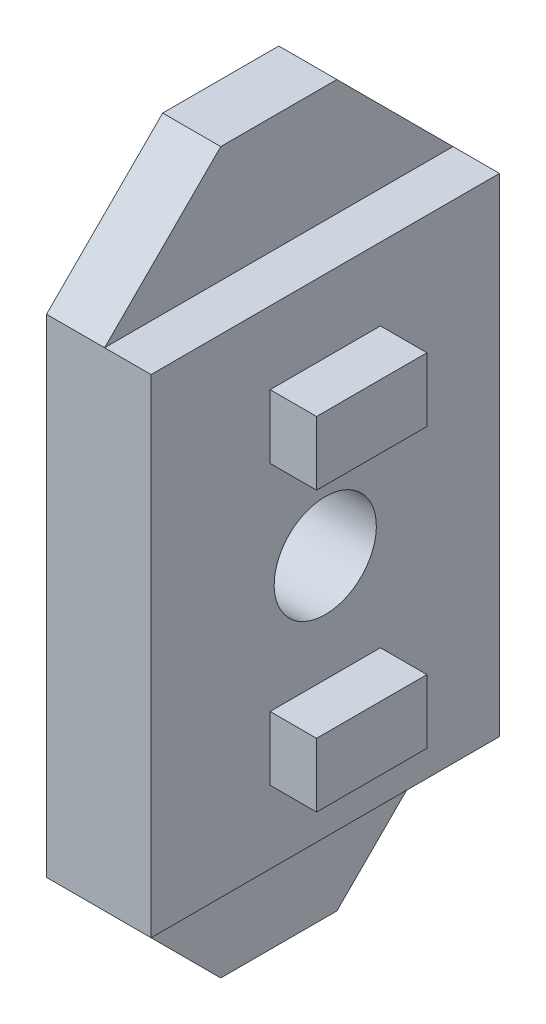
ISO-10303-21;
HEADER;
FILE_DESCRIPTION(('STEP AP214'),'2;1');
FILE_NAME('part.step','',(''),(''),'','','');
FILE_SCHEMA(('AUTOMOTIVE_DESIGN { 1 0 10303 214 1 1 1 1 }'));
ENDSEC;
DATA;
#1=APPLICATION_CONTEXT('core data for automotive mechanical design processes');
#2=APPLICATION_PROTOCOL_DEFINITION('international standard','automotive_design',2000,#1);
#3=PRODUCT_CONTEXT('',#1,'mechanical');
#4=PRODUCT('Part','Part','',(#3));
#5=PRODUCT_RELATED_PRODUCT_CATEGORY('part','',(#4));
#6=PRODUCT_DEFINITION_FORMATION('','',#4);
#7=PRODUCT_DEFINITION_CONTEXT('part definition',#1,'design');
#8=PRODUCT_DEFINITION('design','',#6,#7);
#9=PRODUCT_DEFINITION_SHAPE('','',#8);
#10=(LENGTH_UNIT() NAMED_UNIT(*) SI_UNIT(.MILLI.,.METRE.));
#11=(NAMED_UNIT(*) PLANE_ANGLE_UNIT() SI_UNIT($,.RADIAN.));
#12=(NAMED_UNIT(*) SI_UNIT($,.STERADIAN.) SOLID_ANGLE_UNIT());
#13=UNCERTAINTY_MEASURE_WITH_UNIT(LENGTH_MEASURE(1.E-05),#10,'distance_accuracy_value','');
#14=(GEOMETRIC_REPRESENTATION_CONTEXT(3) GLOBAL_UNCERTAINTY_ASSIGNED_CONTEXT((#13)) GLOBAL_UNIT_ASSIGNED_CONTEXT((#10,
#11,#12)) REPRESENTATION_CONTEXT('',''));
#15=CARTESIAN_POINT('',(0.,0.,0.));
#16=DIRECTION('',(0.,0.,1.));
#17=DIRECTION('',(1.,0.,0.));
#18=AXIS2_PLACEMENT_3D('',#15,#16,#17);
#19=CARTESIAN_POINT('',(68.1666442121514,393.453945818601,315.85001331669));
#20=DIRECTION('',(-1.,0.,0.));
#21=DIRECTION('',(0.,1.,0.));
#22=AXIS2_PLACEMENT_3D('',#19,#20,#21);
#23=CYLINDRICAL_SURFACE('',#22,2.2);
#24=CARTESIAN_POINT('',(74.6666442121514,393.453945818601,315.85001331669));
#25=DIRECTION('',(1.,0.,0.));
#26=DIRECTION('',(0.,1.,0.));
#27=AXIS2_PLACEMENT_3D('',#24,#25,#26);
#28=CIRCLE('',#27,2.2);
#29=CARTESIAN_POINT('',(74.6666442121514,395.653945818601,315.85001331669));
#30=VERTEX_POINT('',#29);
#31=EDGE_CURVE('E448',#30,#30,#28,.T.);
#32=ORIENTED_EDGE('',*,*,#31,.F.);
#33=EDGE_LOOP('',(#32));
#34=FACE_BOUND('',#33,.T.);
#35=CARTESIAN_POINT('',(79.1666442121515,393.453945818601,315.85001331669));
#36=DIRECTION('',(-1.,0.,0.));
#37=DIRECTION('',(0.,1.,0.));
#38=AXIS2_PLACEMENT_3D('',#35,#36,#37);
#39=CIRCLE('',#38,2.2);
#40=CARTESIAN_POINT('',(79.1666442121515,395.653945818601,315.85001331669));
#41=VERTEX_POINT('',#40);
#42=EDGE_CURVE('E218',#41,#41,#39,.T.);
#43=ORIENTED_EDGE('',*,*,#42,.F.);
#44=EDGE_LOOP('',(#43));
#45=FACE_BOUND('',#44,.T.);
#46=ADVANCED_FACE('F16',(#34,#45),#23,.F.);
#47=CARTESIAN_POINT('',(77.1666442121514,380.453945818601,320.85001331669));
#48=DIRECTION('',(0.,-0.707106781186548,0.707106781186548));
#49=DIRECTION('',(1.,0.,0.));
#50=AXIS2_PLACEMENT_3D('',#47,#48,#49);
#51=PLANE('',#50);
#52=DIRECTION('',(0.,-0.707106781186548,-0.707106781186548));
#53=VECTOR('',#52,1.);
#54=CARTESIAN_POINT('',(74.6666442121514,382.453945818601,322.85001331669));
#55=LINE('',#54,#53);
#56=CARTESIAN_POINT('',(74.6666442121514,382.953945818601,323.35001331669));
#57=VERTEX_POINT('',#56);
#58=CARTESIAN_POINT('',(74.6666442121514,377.953945818601,318.35001331669));
#59=VERTEX_POINT('',#58);
#60=EDGE_CURVE('E10',#57,#59,#55,.T.);
#61=ORIENTED_EDGE('',*,*,#60,.T.);
#62=DIRECTION('',(1.,0.,0.));
#63=VECTOR('',#62,1.);
#64=CARTESIAN_POINT('',(77.1666442121514,377.953945818601,318.35001331669));
#65=LINE('',#64,#63);
#66=CARTESIAN_POINT('',(77.1666442121514,377.953945818601,318.35001331669));
#67=VERTEX_POINT('',#66);
#68=EDGE_CURVE('E26',#59,#67,#65,.T.);
#69=ORIENTED_EDGE('',*,*,#68,.T.);
#70=DIRECTION('',(0.,0.707106781186548,0.707106781186548));
#71=VECTOR('',#70,1.);
#72=CARTESIAN_POINT('',(77.1666442121514,382.453945818601,322.85001331669));
#73=LINE('',#72,#71);
#74=CARTESIAN_POINT('',(77.1666442121514,382.953945818601,323.35001331669));
#75=VERTEX_POINT('',#74);
#76=EDGE_CURVE('E447',#67,#75,#73,.T.);
#77=ORIENTED_EDGE('',*,*,#76,.T.);
#78=DIRECTION('',(-1.,0.,0.));
#79=VECTOR('',#78,1.);
#80=CARTESIAN_POINT('',(77.1666442121514,382.953945818601,323.35001331669));
#81=LINE('',#80,#79);
#82=EDGE_CURVE('E441',#75,#57,#81,.T.);
#83=ORIENTED_EDGE('',*,*,#82,.T.);
#84=EDGE_LOOP('',(#61,#69,#77,#83));
#85=FACE_BOUND('',#84,.T.);
#86=ADVANCED_FACE('F296',(#85),#51,.T.);
#87=CARTESIAN_POINT('',(77.1666442121514,377.953945818601,315.85001331669));
#88=DIRECTION('',(0.,1.,0.));
#89=DIRECTION('',(-1.,0.,0.));
#90=AXIS2_PLACEMENT_3D('',#87,#88,#89);
#91=PLANE('',#90);
#92=ORIENTED_EDGE('',*,*,#68,.F.);
#93=DIRECTION('',(0.,0.,1.));
#94=VECTOR('',#93,1.);
#95=CARTESIAN_POINT('',(74.6666442121514,377.953945818601,315.85001331669));
#96=LINE('',#95,#94);
#97=CARTESIAN_POINT('',(74.6666442121514,377.953945818601,313.35001331669));
#98=VERTEX_POINT('',#97);
#99=EDGE_CURVE('E453',#98,#59,#96,.T.);
#100=ORIENTED_EDGE('',*,*,#99,.F.);
#101=DIRECTION('',(-1.,0.,0.));
#102=VECTOR('',#101,1.);
#103=CARTESIAN_POINT('',(77.1666442121514,377.953945818601,313.35001331669));
#104=LINE('',#103,#102);
#105=CARTESIAN_POINT('',(77.1666442121514,377.953945818601,313.35001331669));
#106=VERTEX_POINT('',#105);
#107=EDGE_CURVE('E457',#106,#98,#104,.T.);
#108=ORIENTED_EDGE('',*,*,#107,.F.);
#109=DIRECTION('',(0.,0.,-1.));
#110=VECTOR('',#109,1.);
#111=CARTESIAN_POINT('',(77.1666442121514,377.953945818601,315.85001331669));
#112=LINE('',#111,#110);
#113=EDGE_CURVE('E460',#67,#106,#112,.T.);
#114=ORIENTED_EDGE('',*,*,#113,.F.);
#115=EDGE_LOOP('',(#92,#100,#108,#114));
#116=FACE_BOUND('',#115,.T.);
#117=ADVANCED_FACE('F302',(#116),#91,.F.);
#118=CARTESIAN_POINT('',(74.6666442121514,393.453945818601,315.85001331669));
#119=DIRECTION('',(1.,0.,0.));
#120=DIRECTION('',(0.,1.,0.));
#121=AXIS2_PLACEMENT_3D('',#118,#119,#120);
#122=PLANE('',#121);
#123=ORIENTED_EDGE('',*,*,#31,.T.);
#124=EDGE_LOOP('',(#123));
#125=FACE_BOUND('',#124,.T.);
#126=ORIENTED_EDGE('',*,*,#60,.F.);
#127=DIRECTION('',(0.,1.,0.));
#128=VECTOR('',#127,1.);
#129=CARTESIAN_POINT('',(74.6666442121514,393.453945818601,323.35001331669));
#130=LINE('',#129,#128);
#131=CARTESIAN_POINT('',(74.6666442121514,403.953945818601,323.35001331669));
#132=VERTEX_POINT('',#131);
#133=EDGE_CURVE('E445',#57,#132,#130,.T.);
#134=ORIENTED_EDGE('',*,*,#133,.T.);
#135=DIRECTION('',(0.,-0.707106781186548,0.707106781186548));
#136=VECTOR('',#135,1.);
#137=CARTESIAN_POINT('',(74.6666442121514,404.453945818601,322.85001331669));
#138=LINE('',#137,#136);
#139=CARTESIAN_POINT('',(74.6666442121514,408.953945818601,318.35001331669));
#140=VERTEX_POINT('',#139);
#141=EDGE_CURVE('E456',#140,#132,#138,.T.);
#142=ORIENTED_EDGE('',*,*,#141,.F.);
#143=DIRECTION('',(0.,0.,-1.));
#144=VECTOR('',#143,1.);
#145=CARTESIAN_POINT('',(74.6666442121514,408.953945818601,315.85001331669));
#146=LINE('',#145,#144);
#147=CARTESIAN_POINT('',(74.6666442121514,408.953945818601,313.35001331669));
#148=VERTEX_POINT('',#147);
#149=EDGE_CURVE('E463',#140,#148,#146,.T.);
#150=ORIENTED_EDGE('',*,*,#149,.T.);
#151=DIRECTION('',(0.,0.707106781186548,0.707106781186548));
#152=VECTOR('',#151,1.);
#153=CARTESIAN_POINT('',(74.6666442121514,404.453945818601,308.85001331669));
#154=LINE('',#153,#152);
#155=CARTESIAN_POINT('',(74.6666442121514,403.953945818601,308.35001331669));
#156=VERTEX_POINT('',#155);
#157=EDGE_CURVE('E197',#156,#148,#154,.T.);
#158=ORIENTED_EDGE('',*,*,#157,.F.);
#159=DIRECTION('',(0.,-1.,0.));
#160=VECTOR('',#159,1.);
#161=CARTESIAN_POINT('',(74.6666442121514,393.453945818601,308.35001331669));
#162=LINE('',#161,#160);
#163=CARTESIAN_POINT('',(74.6666442121514,382.953945818601,308.35001331669));
#164=VERTEX_POINT('',#163);
#165=EDGE_CURVE('E188',#156,#164,#162,.T.);
#166=ORIENTED_EDGE('',*,*,#165,.T.);
#167=DIRECTION('',(0.,0.707106781186548,-0.707106781186548));
#168=VECTOR('',#167,1.);
#169=CARTESIAN_POINT('',(74.6666442121514,382.453945818601,308.85001331669));
#170=LINE('',#169,#168);
#171=EDGE_CURVE('E470',#98,#164,#170,.T.);
#172=ORIENTED_EDGE('',*,*,#171,.F.);
#173=ORIENTED_EDGE('',*,*,#99,.T.);
#174=EDGE_LOOP('',(#126,#134,#142,#150,#158,#166,#172,#173));
#175=FACE_BOUND('',#174,.T.);
#176=ADVANCED_FACE('F310',(#125,#175),#122,.F.);
#177=CARTESIAN_POINT('',(77.1666442121514,406.453945818601,320.85001331669));
#178=DIRECTION('',(0.,0.707106781186548,0.707106781186548));
#179=DIRECTION('',(-1.,0.,0.));
#180=AXIS2_PLACEMENT_3D('',#177,#178,#179);
#181=PLANE('',#180);
#182=ORIENTED_EDGE('',*,*,#141,.T.);
#183=DIRECTION('',(1.,0.,0.));
#184=VECTOR('',#183,1.);
#185=CARTESIAN_POINT('',(77.1666442121514,403.953945818601,323.35001331669));
#186=LINE('',#185,#184);
#187=CARTESIAN_POINT('',(77.1666442121514,403.953945818601,323.35001331669));
#188=VERTEX_POINT('',#187);
#189=EDGE_CURVE('E465',#132,#188,#186,.T.);
#190=ORIENTED_EDGE('',*,*,#189,.T.);
#191=DIRECTION('',(0.,0.707106781186548,-0.707106781186548));
#192=VECTOR('',#191,1.);
#193=CARTESIAN_POINT('',(77.1666442121514,404.453945818601,322.85001331669));
#194=LINE('',#193,#192);
#195=CARTESIAN_POINT('',(77.1666442121514,408.953945818601,318.35001331669));
#196=VERTEX_POINT('',#195);
#197=EDGE_CURVE('E178',#188,#196,#194,.T.);
#198=ORIENTED_EDGE('',*,*,#197,.T.);
#199=DIRECTION('',(-1.,0.,0.));
#200=VECTOR('',#199,1.);
#201=CARTESIAN_POINT('',(77.1666442121514,408.953945818601,318.35001331669));
#202=LINE('',#201,#200);
#203=EDGE_CURVE('E472',#196,#140,#202,.T.);
#204=ORIENTED_EDGE('',*,*,#203,.T.);
#205=EDGE_LOOP('',(#182,#190,#198,#204));
#206=FACE_BOUND('',#205,.T.);
#207=ADVANCED_FACE('F313',(#206),#181,.T.);
#208=CARTESIAN_POINT('',(77.1666442121514,408.953945818601,315.85001331669));
#209=DIRECTION('',(0.,-1.,0.));
#210=DIRECTION('',(1.,0.,0.));
#211=AXIS2_PLACEMENT_3D('',#208,#209,#210);
#212=PLANE('',#211);
#213=ORIENTED_EDGE('',*,*,#203,.F.);
#214=DIRECTION('',(0.,0.,1.));
#215=VECTOR('',#214,1.);
#216=CARTESIAN_POINT('',(77.1666442121514,408.953945818601,315.85001331669));
#217=LINE('',#216,#215);
#218=CARTESIAN_POINT('',(77.1666442121514,408.953945818601,313.35001331669));
#219=VERTEX_POINT('',#218);
#220=EDGE_CURVE('E162',#219,#196,#217,.T.);
#221=ORIENTED_EDGE('',*,*,#220,.F.);
#222=DIRECTION('',(1.,0.,0.));
#223=VECTOR('',#222,1.);
#224=CARTESIAN_POINT('',(77.1666442121514,408.953945818601,313.35001331669));
#225=LINE('',#224,#223);
#226=EDGE_CURVE('E195',#148,#219,#225,.T.);
#227=ORIENTED_EDGE('',*,*,#226,.F.);
#228=ORIENTED_EDGE('',*,*,#149,.F.);
#229=EDGE_LOOP('',(#213,#221,#227,#228));
#230=FACE_BOUND('',#229,.T.);
#231=ADVANCED_FACE('F317',(#230),#212,.F.);
#232=CARTESIAN_POINT('',(77.1666442121514,380.453945818601,310.85001331669));
#233=DIRECTION('',(0.,-0.707106781186548,-0.707106781186548));
#234=DIRECTION('',(1.,0.,0.));
#235=AXIS2_PLACEMENT_3D('',#232,#233,#234);
#236=PLANE('',#235);
#237=ORIENTED_EDGE('',*,*,#171,.T.);
#238=DIRECTION('',(1.,0.,0.));
#239=VECTOR('',#238,1.);
#240=CARTESIAN_POINT('',(77.1666442121514,382.953945818601,308.35001331669));
#241=LINE('',#240,#239);
#242=CARTESIAN_POINT('',(77.1666442121514,382.953945818601,308.35001331669));
#243=VERTEX_POINT('',#242);
#244=EDGE_CURVE('E473',#164,#243,#241,.T.);
#245=ORIENTED_EDGE('',*,*,#244,.T.);
#246=DIRECTION('',(0.,-0.707106781186548,0.707106781186548));
#247=VECTOR('',#246,1.);
#248=CARTESIAN_POINT('',(77.1666442121514,382.453945818601,308.85001331669));
#249=LINE('',#248,#247);
#250=EDGE_CURVE('E459',#243,#106,#249,.T.);
#251=ORIENTED_EDGE('',*,*,#250,.T.);
#252=ORIENTED_EDGE('',*,*,#107,.T.);
#253=EDGE_LOOP('',(#237,#245,#251,#252));
#254=FACE_BOUND('',#253,.T.);
#255=ADVANCED_FACE('F321',(#254),#236,.T.);
#256=CARTESIAN_POINT('',(77.1666442121514,393.453945818601,315.85001331669));
#257=DIRECTION('',(1.,0.,0.));
#258=DIRECTION('',(0.,1.,0.));
#259=AXIS2_PLACEMENT_3D('',#256,#257,#258);
#260=PLANE('',#259);
#261=ORIENTED_EDGE('',*,*,#76,.F.);
#262=ORIENTED_EDGE('',*,*,#113,.T.);
#263=ORIENTED_EDGE('',*,*,#250,.F.);
#264=DIRECTION('',(0.,0.,1.));
#265=VECTOR('',#264,1.);
#266=CARTESIAN_POINT('',(77.1666442121514,382.953945818601,315.85001331669));
#267=LINE('',#266,#265);
#268=EDGE_CURVE('E160',#243,#75,#267,.T.);
#269=ORIENTED_EDGE('',*,*,#268,.T.);
#270=EDGE_LOOP('',(#261,#262,#263,#269));
#271=FACE_BOUND('',#270,.T.);
#272=ADVANCED_FACE('F325',(#271),#260,.T.);
#273=CARTESIAN_POINT('',(77.1666442121514,406.453945818601,310.85001331669));
#274=DIRECTION('',(0.,0.707106781186548,-0.707106781186548));
#275=DIRECTION('',(-1.,0.,0.));
#276=AXIS2_PLACEMENT_3D('',#273,#274,#275);
#277=PLANE('',#276);
#278=ORIENTED_EDGE('',*,*,#157,.T.);
#279=ORIENTED_EDGE('',*,*,#226,.T.);
#280=DIRECTION('',(0.,-0.707106781186548,-0.707106781186548));
#281=VECTOR('',#280,1.);
#282=CARTESIAN_POINT('',(77.1666442121514,404.453945818601,308.85001331669));
#283=LINE('',#282,#281);
#284=CARTESIAN_POINT('',(77.1666442121514,403.953945818601,308.35001331669));
#285=VERTEX_POINT('',#284);
#286=EDGE_CURVE('E176',#219,#285,#283,.T.);
#287=ORIENTED_EDGE('',*,*,#286,.T.);
#288=DIRECTION('',(-1.,0.,0.));
#289=VECTOR('',#288,1.);
#290=CARTESIAN_POINT('',(77.1666442121514,403.953945818601,308.35001331669));
#291=LINE('',#290,#289);
#292=EDGE_CURVE('E186',#285,#156,#291,.T.);
#293=ORIENTED_EDGE('',*,*,#292,.T.);
#294=EDGE_LOOP('',(#278,#279,#287,#293));
#295=FACE_BOUND('',#294,.T.);
#296=ADVANCED_FACE('F193',(#295),#277,.T.);
#297=CARTESIAN_POINT('',(80.1666442121516,387.453945818601,313.47501331669));
#298=DIRECTION('',(0.,0.,1.));
#299=DIRECTION('',(-1.,0.,0.));
#300=AXIS2_PLACEMENT_3D('',#297,#298,#299);
#301=PLANE('',#300);
#302=DIRECTION('',(0.,-1.,0.));
#303=VECTOR('',#302,1.);
#304=CARTESIAN_POINT('',(79.1666442121515,390.453945818601,313.47501331669));
#305=LINE('',#304,#303);
#306=CARTESIAN_POINT('',(79.1666442121513,388.828945818601,313.47501331669));
#307=VERTEX_POINT('',#306);
#308=CARTESIAN_POINT('',(79.1666442121513,386.078945818601,313.47501331669));
#309=VERTEX_POINT('',#308);
#310=EDGE_CURVE('E202',#307,#309,#305,.T.);
#311=ORIENTED_EDGE('',*,*,#310,.F.);
#312=DIRECTION('',(1.,0.,0.));
#313=VECTOR('',#312,1.);
#314=CARTESIAN_POINT('',(80.1666442121516,388.828945818601,313.47501331669));
#315=LINE('',#314,#313);
#316=CARTESIAN_POINT('',(81.1666442121515,388.828945818601,313.47501331669));
#317=VERTEX_POINT('',#316);
#318=EDGE_CURVE('E190',#307,#317,#315,.T.);
#319=ORIENTED_EDGE('',*,*,#318,.T.);
#320=DIRECTION('',(0.,1.,0.));
#321=VECTOR('',#320,1.);
#322=CARTESIAN_POINT('',(81.1666442121515,387.453945818601,313.47501331669));
#323=LINE('',#322,#321);
#324=CARTESIAN_POINT('',(81.1666442121515,386.078945818601,313.47501331669));
#325=VERTEX_POINT('',#324);
#326=EDGE_CURVE('E209',#325,#317,#323,.T.);
#327=ORIENTED_EDGE('',*,*,#326,.F.);
#328=DIRECTION('',(1.,0.,0.));
#329=VECTOR('',#328,1.);
#330=CARTESIAN_POINT('',(80.1666442121516,386.078945818601,313.47501331669));
#331=LINE('',#330,#329);
#332=EDGE_CURVE('E212',#309,#325,#331,.T.);
#333=ORIENTED_EDGE('',*,*,#332,.F.);
#334=EDGE_LOOP('',(#311,#319,#327,#333));
#335=FACE_BOUND('',#334,.T.);
#336=ADVANCED_FACE('F332',(#335),#301,.F.);
#337=CARTESIAN_POINT('',(80.1666442121516,388.828945818601,315.85001331669));
#338=DIRECTION('',(0.,-1.,0.));
#339=DIRECTION('',(-1.,0.,0.));
#340=AXIS2_PLACEMENT_3D('',#337,#338,#339);
#341=PLANE('',#340);
#342=DIRECTION('',(0.,0.,-1.));
#343=VECTOR('',#342,1.);
#344=CARTESIAN_POINT('',(79.1666442121515,388.828945818601,315.85001331669));
#345=LINE('',#344,#343);
#346=CARTESIAN_POINT('',(79.1666442121513,388.828945818601,318.22501331669));
#347=VERTEX_POINT('',#346);
#348=EDGE_CURVE('E204',#347,#307,#345,.T.);
#349=ORIENTED_EDGE('',*,*,#348,.F.);
#350=DIRECTION('',(1.,0.,0.));
#351=VECTOR('',#350,1.);
#352=CARTESIAN_POINT('',(80.1666442121516,388.828945818601,318.22501331669));
#353=LINE('',#352,#351);
#354=CARTESIAN_POINT('',(81.1666442121515,388.828945818601,318.22501331669));
#355=VERTEX_POINT('',#354);
#356=EDGE_CURVE('E208',#347,#355,#353,.T.);
#357=ORIENTED_EDGE('',*,*,#356,.T.);
#358=DIRECTION('',(0.,0.,1.));
#359=VECTOR('',#358,1.);
#360=CARTESIAN_POINT('',(81.1666442121515,388.828945818601,315.85001331669));
#361=LINE('',#360,#359);
#362=EDGE_CURVE('E211',#317,#355,#361,.T.);
#363=ORIENTED_EDGE('',*,*,#362,.F.);
#364=ORIENTED_EDGE('',*,*,#318,.F.);
#365=EDGE_LOOP('',(#349,#357,#363,#364));
#366=FACE_BOUND('',#365,.T.);
#367=ADVANCED_FACE('F335',(#366),#341,.F.);
#368=CARTESIAN_POINT('',(81.1666442121515,387.453945818601,315.85001331669));
#369=DIRECTION('',(-1.,0.,0.));
#370=DIRECTION('',(0.,0.,-1.));
#371=AXIS2_PLACEMENT_3D('',#368,#369,#370);
#372=PLANE('',#371);
#373=ORIENTED_EDGE('',*,*,#326,.T.);
#374=ORIENTED_EDGE('',*,*,#362,.T.);
#375=DIRECTION('',(0.,-1.,0.));
#376=VECTOR('',#375,1.);
#377=CARTESIAN_POINT('',(81.1666442121515,387.453945818601,318.22501331669));
#378=LINE('',#377,#376);
#379=CARTESIAN_POINT('',(81.1666442121515,386.078945818601,318.22501331669));
#380=VERTEX_POINT('',#379);
#381=EDGE_CURVE('E222',#355,#380,#378,.T.);
#382=ORIENTED_EDGE('',*,*,#381,.T.);
#383=DIRECTION('',(0.,0.,-1.));
#384=VECTOR('',#383,1.);
#385=CARTESIAN_POINT('',(81.1666442121515,386.078945818601,315.85001331669));
#386=LINE('',#385,#384);
#387=EDGE_CURVE('E225',#380,#325,#386,.T.);
#388=ORIENTED_EDGE('',*,*,#387,.T.);
#389=EDGE_LOOP('',(#373,#374,#382,#388));
#390=FACE_BOUND('',#389,.T.);
#391=ADVANCED_FACE('F339',(#390),#372,.F.);
#392=CARTESIAN_POINT('',(80.1666442121516,387.453945818601,318.22501331669));
#393=DIRECTION('',(0.,0.,-1.));
#394=DIRECTION('',(1.,0.,0.));
#395=AXIS2_PLACEMENT_3D('',#392,#393,#394);
#396=PLANE('',#395);
#397=DIRECTION('',(0.,1.,0.));
#398=VECTOR('',#397,1.);
#399=CARTESIAN_POINT('',(79.1666442121515,390.453945818601,318.22501331669));
#400=LINE('',#399,#398);
#401=CARTESIAN_POINT('',(79.1666442121513,386.078945818601,318.22501331669));
#402=VERTEX_POINT('',#401);
#403=EDGE_CURVE('E228',#402,#347,#400,.T.);
#404=ORIENTED_EDGE('',*,*,#403,.F.);
#405=DIRECTION('',(1.,0.,0.));
#406=VECTOR('',#405,1.);
#407=CARTESIAN_POINT('',(80.1666442121516,386.078945818601,318.22501331669));
#408=LINE('',#407,#406);
#409=EDGE_CURVE('E214',#402,#380,#408,.T.);
#410=ORIENTED_EDGE('',*,*,#409,.T.);
#411=ORIENTED_EDGE('',*,*,#381,.F.);
#412=ORIENTED_EDGE('',*,*,#356,.F.);
#413=EDGE_LOOP('',(#404,#410,#411,#412));
#414=FACE_BOUND('',#413,.T.);
#415=ADVANCED_FACE('F343',(#414),#396,.F.);
#416=CARTESIAN_POINT('',(80.1666442121516,386.078945818601,315.85001331669));
#417=DIRECTION('',(0.,1.,0.));
#418=DIRECTION('',(1.,0.,0.));
#419=AXIS2_PLACEMENT_3D('',#416,#417,#418);
#420=PLANE('',#419);
#421=DIRECTION('',(0.,0.,1.));
#422=VECTOR('',#421,1.);
#423=CARTESIAN_POINT('',(79.1666442121515,386.078945818601,315.85001331669));
#424=LINE('',#423,#422);
#425=EDGE_CURVE('E205',#309,#402,#424,.T.);
#426=ORIENTED_EDGE('',*,*,#425,.F.);
#427=ORIENTED_EDGE('',*,*,#332,.T.);
#428=ORIENTED_EDGE('',*,*,#387,.F.);
#429=ORIENTED_EDGE('',*,*,#409,.F.);
#430=EDGE_LOOP('',(#426,#427,#428,#429));
#431=FACE_BOUND('',#430,.T.);
#432=ADVANCED_FACE('F347',(#431),#420,.F.);
#433=CARTESIAN_POINT('',(80.1666442121516,399.453945818601,313.47501331669));
#434=DIRECTION('',(0.,0.,1.));
#435=DIRECTION('',(-1.,0.,0.));
#436=AXIS2_PLACEMENT_3D('',#433,#434,#435);
#437=PLANE('',#436);
#438=DIRECTION('',(0.,-1.,0.));
#439=VECTOR('',#438,1.);
#440=CARTESIAN_POINT('',(79.1666442121515,396.453945818601,313.47501331669));
#441=LINE('',#440,#439);
#442=CARTESIAN_POINT('',(79.1666442121513,400.828945818601,313.47501331669));
#443=VERTEX_POINT('',#442);
#444=CARTESIAN_POINT('',(79.1666442121513,398.078945818601,313.47501331669));
#445=VERTEX_POINT('',#444);
#446=EDGE_CURVE('E236',#443,#445,#441,.T.);
#447=ORIENTED_EDGE('',*,*,#446,.F.);
#448=DIRECTION('',(1.,0.,0.));
#449=VECTOR('',#448,1.);
#450=CARTESIAN_POINT('',(80.1666442121516,400.828945818601,313.47501331669));
#451=LINE('',#450,#449);
#452=CARTESIAN_POINT('',(81.1666442121515,400.828945818601,313.47501331669));
#453=VERTEX_POINT('',#452);
#454=EDGE_CURVE('E215',#443,#453,#451,.T.);
#455=ORIENTED_EDGE('',*,*,#454,.T.);
#456=DIRECTION('',(0.,1.,0.));
#457=VECTOR('',#456,1.);
#458=CARTESIAN_POINT('',(81.1666442121515,399.453945818601,313.47501331669));
#459=LINE('',#458,#457);
#460=CARTESIAN_POINT('',(81.1666442121515,398.078945818601,313.47501331669));
#461=VERTEX_POINT('',#460);
#462=EDGE_CURVE('E242',#461,#453,#459,.T.);
#463=ORIENTED_EDGE('',*,*,#462,.F.);
#464=DIRECTION('',(1.,0.,0.));
#465=VECTOR('',#464,1.);
#466=CARTESIAN_POINT('',(80.1666442121516,398.078945818601,313.47501331669));
#467=LINE('',#466,#465);
#468=EDGE_CURVE('E245',#445,#461,#467,.T.);
#469=ORIENTED_EDGE('',*,*,#468,.F.);
#470=EDGE_LOOP('',(#447,#455,#463,#469));
#471=FACE_BOUND('',#470,.T.);
#472=ADVANCED_FACE('F283',(#471),#437,.F.);
#473=CARTESIAN_POINT('',(80.1666442121516,400.828945818601,315.85001331669));
#474=DIRECTION('',(0.,-1.,0.));
#475=DIRECTION('',(-1.,0.,0.));
#476=AXIS2_PLACEMENT_3D('',#473,#474,#475);
#477=PLANE('',#476);
#478=DIRECTION('',(0.,0.,-1.));
#479=VECTOR('',#478,1.);
#480=CARTESIAN_POINT('',(79.1666442121515,400.828945818601,315.85001331669));
#481=LINE('',#480,#479);
#482=CARTESIAN_POINT('',(79.1666442121513,400.828945818601,318.22501331669));
#483=VERTEX_POINT('',#482);
#484=EDGE_CURVE('E231',#483,#443,#481,.T.);
#485=ORIENTED_EDGE('',*,*,#484,.F.);
#486=DIRECTION('',(1.,0.,0.));
#487=VECTOR('',#486,1.);
#488=CARTESIAN_POINT('',(80.1666442121516,400.828945818601,318.22501331669));
#489=LINE('',#488,#487);
#490=CARTESIAN_POINT('',(81.1666442121515,400.828945818601,318.22501331669));
#491=VERTEX_POINT('',#490);
#492=EDGE_CURVE('E241',#483,#491,#489,.T.);
#493=ORIENTED_EDGE('',*,*,#492,.T.);
#494=DIRECTION('',(0.,0.,1.));
#495=VECTOR('',#494,1.);
#496=CARTESIAN_POINT('',(81.1666442121515,400.828945818601,315.85001331669));
#497=LINE('',#496,#495);
#498=EDGE_CURVE('E244',#453,#491,#497,.T.);
#499=ORIENTED_EDGE('',*,*,#498,.F.);
#500=ORIENTED_EDGE('',*,*,#454,.F.);
#501=EDGE_LOOP('',(#485,#493,#499,#500));
#502=FACE_BOUND('',#501,.T.);
#503=ADVANCED_FACE('F280',(#502),#477,.F.);
#504=CARTESIAN_POINT('',(81.1666442121515,399.453945818601,315.85001331669));
#505=DIRECTION('',(-1.,0.,0.));
#506=DIRECTION('',(0.,0.,-1.));
#507=AXIS2_PLACEMENT_3D('',#504,#505,#506);
#508=PLANE('',#507);
#509=ORIENTED_EDGE('',*,*,#462,.T.);
#510=ORIENTED_EDGE('',*,*,#498,.T.);
#511=DIRECTION('',(0.,-1.,0.));
#512=VECTOR('',#511,1.);
#513=CARTESIAN_POINT('',(81.1666442121515,399.453945818601,318.22501331669));
#514=LINE('',#513,#512);
#515=CARTESIAN_POINT('',(81.1666442121515,398.078945818601,318.22501331669));
#516=VERTEX_POINT('',#515);
#517=EDGE_CURVE('E253',#491,#516,#514,.T.);
#518=ORIENTED_EDGE('',*,*,#517,.T.);
#519=DIRECTION('',(0.,0.,-1.));
#520=VECTOR('',#519,1.);
#521=CARTESIAN_POINT('',(81.1666442121515,398.078945818601,315.85001331669));
#522=LINE('',#521,#520);
#523=EDGE_CURVE('E256',#516,#461,#522,.T.);
#524=ORIENTED_EDGE('',*,*,#523,.T.);
#525=EDGE_LOOP('',(#509,#510,#518,#524));
#526=FACE_BOUND('',#525,.T.);
#527=ADVANCED_FACE('F285',(#526),#508,.F.);
#528=CARTESIAN_POINT('',(80.1666442121516,399.453945818601,318.22501331669));
#529=DIRECTION('',(0.,0.,-1.));
#530=DIRECTION('',(1.,0.,0.));
#531=AXIS2_PLACEMENT_3D('',#528,#529,#530);
#532=PLANE('',#531);
#533=DIRECTION('',(0.,1.,0.));
#534=VECTOR('',#533,1.);
#535=CARTESIAN_POINT('',(79.1666442121515,396.453945818601,318.22501331669));
#536=LINE('',#535,#534);
#537=CARTESIAN_POINT('',(79.1666442121513,398.078945818601,318.22501331669));
#538=VERTEX_POINT('',#537);
#539=EDGE_CURVE('E259',#538,#483,#536,.T.);
#540=ORIENTED_EDGE('',*,*,#539,.F.);
#541=DIRECTION('',(1.,0.,0.));
#542=VECTOR('',#541,1.);
#543=CARTESIAN_POINT('',(80.1666442121516,398.078945818601,318.22501331669));
#544=LINE('',#543,#542);
#545=EDGE_CURVE('E247',#538,#516,#544,.T.);
#546=ORIENTED_EDGE('',*,*,#545,.T.);
#547=ORIENTED_EDGE('',*,*,#517,.F.);
#548=ORIENTED_EDGE('',*,*,#492,.F.);
#549=EDGE_LOOP('',(#540,#546,#547,#548));
#550=FACE_BOUND('',#549,.T.);
#551=ADVANCED_FACE('F276',(#550),#532,.F.);
#552=CARTESIAN_POINT('',(80.1666442121516,398.078945818601,315.85001331669));
#553=DIRECTION('',(0.,1.,0.));
#554=DIRECTION('',(1.,0.,0.));
#555=AXIS2_PLACEMENT_3D('',#552,#553,#554);
#556=PLANE('',#555);
#557=DIRECTION('',(0.,0.,1.));
#558=VECTOR('',#557,1.);
#559=CARTESIAN_POINT('',(79.1666442121515,398.078945818601,315.85001331669));
#560=LINE('',#559,#558);
#561=EDGE_CURVE('E238',#445,#538,#560,.T.);
#562=ORIENTED_EDGE('',*,*,#561,.F.);
#563=ORIENTED_EDGE('',*,*,#468,.T.);
#564=ORIENTED_EDGE('',*,*,#523,.F.);
#565=ORIENTED_EDGE('',*,*,#545,.F.);
#566=EDGE_LOOP('',(#562,#563,#564,#565));
#567=FACE_BOUND('',#566,.T.);
#568=ADVANCED_FACE('F272',(#567),#556,.F.);
#569=CARTESIAN_POINT('',(79.1666442121515,393.453945818601,315.85001331669));
#570=DIRECTION('',(1.,0.,0.));
#571=DIRECTION('',(0.,1.,0.));
#572=AXIS2_PLACEMENT_3D('',#569,#570,#571);
#573=PLANE('',#572);
#574=ORIENTED_EDGE('',*,*,#42,.T.);
#575=EDGE_LOOP('',(#574));
#576=FACE_BOUND('',#575,.T.);
#577=ORIENTED_EDGE('',*,*,#348,.T.);
#578=ORIENTED_EDGE('',*,*,#310,.T.);
#579=ORIENTED_EDGE('',*,*,#425,.T.);
#580=ORIENTED_EDGE('',*,*,#403,.T.);
#581=EDGE_LOOP('',(#577,#578,#579,#580));
#582=FACE_BOUND('',#581,.T.);
#583=ORIENTED_EDGE('',*,*,#484,.T.);
#584=ORIENTED_EDGE('',*,*,#446,.T.);
#585=ORIENTED_EDGE('',*,*,#561,.T.);
#586=ORIENTED_EDGE('',*,*,#539,.T.);
#587=EDGE_LOOP('',(#583,#584,#585,#586));
#588=FACE_BOUND('',#587,.T.);
#589=DIRECTION('',(0.,0.,1.));
#590=VECTOR('',#589,1.);
#591=CARTESIAN_POINT('',(79.1666442121515,403.953945818601,315.85001331669));
#592=LINE('',#591,#590);
#593=CARTESIAN_POINT('',(79.1666442121515,403.953945818601,308.35001331669));
#594=VERTEX_POINT('',#593);
#595=CARTESIAN_POINT('',(79.1666442121515,403.953945818601,323.35001331669));
#596=VERTEX_POINT('',#595);
#597=EDGE_CURVE('E183',#594,#596,#592,.T.);
#598=ORIENTED_EDGE('',*,*,#597,.T.);
#599=DIRECTION('',(0.,-1.,0.));
#600=VECTOR('',#599,1.);
#601=CARTESIAN_POINT('',(79.1666442121515,393.453945818601,323.35001331669));
#602=LINE('',#601,#600);
#603=CARTESIAN_POINT('',(79.1666442121515,382.953945818601,323.35001331669));
#604=VERTEX_POINT('',#603);
#605=EDGE_CURVE('E156',#596,#604,#602,.T.);
#606=ORIENTED_EDGE('',*,*,#605,.T.);
#607=DIRECTION('',(0.,0.,-1.));
#608=VECTOR('',#607,1.);
#609=CARTESIAN_POINT('',(79.1666442121515,382.953945818601,315.85001331669));
#610=LINE('',#609,#608);
#611=CARTESIAN_POINT('',(79.1666442121515,382.953945818601,308.35001331669));
#612=VERTEX_POINT('',#611);
#613=EDGE_CURVE('E138',#604,#612,#610,.T.);
#614=ORIENTED_EDGE('',*,*,#613,.T.);
#615=DIRECTION('',(0.,1.,0.));
#616=VECTOR('',#615,1.);
#617=CARTESIAN_POINT('',(79.1666442121515,393.453945818601,308.35001331669));
#618=LINE('',#617,#616);
#619=EDGE_CURVE('E144',#612,#594,#618,.T.);
#620=ORIENTED_EDGE('',*,*,#619,.T.);
#621=EDGE_LOOP('',(#598,#606,#614,#620));
#622=FACE_BOUND('',#621,.T.);
#623=ADVANCED_FACE('F155',(#576,#582,#588,#622),#573,.T.);
#624=CARTESIAN_POINT('',(79.6666442121514,382.953945818601,315.85001331669));
#625=DIRECTION('',(0.,1.,0.));
#626=DIRECTION('',(-1.,0.,0.));
#627=AXIS2_PLACEMENT_3D('',#624,#625,#626);
#628=PLANE('',#627);
#629=DIRECTION('',(-1.,0.,0.));
#630=VECTOR('',#629,1.);
#631=CARTESIAN_POINT('',(79.6666442121514,382.953945818601,323.35001331669));
#632=LINE('',#631,#630);
#633=EDGE_CURVE('E153',#604,#75,#632,.T.);
#634=ORIENTED_EDGE('',*,*,#633,.T.);
#635=ORIENTED_EDGE('',*,*,#268,.F.);
#636=DIRECTION('',(-1.,0.,0.));
#637=VECTOR('',#636,1.);
#638=CARTESIAN_POINT('',(79.6666442121514,382.953945818601,308.35001331669));
#639=LINE('',#638,#637);
#640=EDGE_CURVE('E147',#612,#243,#639,.T.);
#641=ORIENTED_EDGE('',*,*,#640,.F.);
#642=ORIENTED_EDGE('',*,*,#613,.F.);
#643=EDGE_LOOP('',(#634,#635,#641,#642));
#644=FACE_BOUND('',#643,.T.);
#645=ADVANCED_FACE('F159',(#644),#628,.F.);
#646=CARTESIAN_POINT('',(79.6666442121514,403.953945818601,315.85001331669));
#647=DIRECTION('',(0.,-1.,0.));
#648=DIRECTION('',(1.,0.,0.));
#649=AXIS2_PLACEMENT_3D('',#646,#647,#648);
#650=PLANE('',#649);
#651=DIRECTION('',(-1.,0.,0.));
#652=VECTOR('',#651,1.);
#653=CARTESIAN_POINT('',(79.6666442121514,403.953945818601,308.35001331669));
#654=LINE('',#653,#652);
#655=EDGE_CURVE('E149',#594,#285,#654,.T.);
#656=ORIENTED_EDGE('',*,*,#655,.T.);
#657=DIRECTION('',(0.,0.,-1.));
#658=VECTOR('',#657,1.);
#659=CARTESIAN_POINT('',(77.1666442121514,403.953945818601,315.85001331669));
#660=LINE('',#659,#658);
#661=EDGE_CURVE('E165',#188,#285,#660,.T.);
#662=ORIENTED_EDGE('',*,*,#661,.F.);
#663=DIRECTION('',(-1.,0.,0.));
#664=VECTOR('',#663,1.);
#665=CARTESIAN_POINT('',(79.6666442121514,403.953945818601,323.35001331669));
#666=LINE('',#665,#664);
#667=EDGE_CURVE('E20',#596,#188,#666,.T.);
#668=ORIENTED_EDGE('',*,*,#667,.F.);
#669=ORIENTED_EDGE('',*,*,#597,.F.);
#670=EDGE_LOOP('',(#656,#662,#668,#669));
#671=FACE_BOUND('',#670,.T.);
#672=ADVANCED_FACE('F182',(#671),#650,.F.);
#673=CARTESIAN_POINT('',(77.1666442121514,393.453945818601,315.85001331669));
#674=DIRECTION('',(1.,0.,0.));
#675=DIRECTION('',(0.,1.,0.));
#676=AXIS2_PLACEMENT_3D('',#673,#674,#675);
#677=PLANE('',#676);
#678=ORIENTED_EDGE('',*,*,#197,.F.);
#679=ORIENTED_EDGE('',*,*,#661,.T.);
#680=ORIENTED_EDGE('',*,*,#286,.F.);
#681=ORIENTED_EDGE('',*,*,#220,.T.);
#682=EDGE_LOOP('',(#678,#679,#680,#681));
#683=FACE_BOUND('',#682,.T.);
#684=ADVANCED_FACE('F174',(#683),#677,.T.);
#685=CARTESIAN_POINT('',(77.1666442121514,393.453945818601,308.35001331669));
#686=DIRECTION('',(0.,0.,1.));
#687=DIRECTION('',(1.,0.,0.));
#688=AXIS2_PLACEMENT_3D('',#685,#686,#687);
#689=PLANE('',#688);
#690=ORIENTED_EDGE('',*,*,#244,.F.);
#691=ORIENTED_EDGE('',*,*,#165,.F.);
#692=ORIENTED_EDGE('',*,*,#292,.F.);
#693=ORIENTED_EDGE('',*,*,#655,.F.);
#694=ORIENTED_EDGE('',*,*,#619,.F.);
#695=ORIENTED_EDGE('',*,*,#640,.T.);
#696=EDGE_LOOP('',(#690,#691,#692,#693,#694,#695));
#697=FACE_BOUND('',#696,.T.);
#698=ADVANCED_FACE('F146',(#697),#689,.F.);
#699=CARTESIAN_POINT('',(77.1666442121514,393.453945818601,323.35001331669));
#700=DIRECTION('',(0.,0.,-1.));
#701=DIRECTION('',(-1.,0.,0.));
#702=AXIS2_PLACEMENT_3D('',#699,#700,#701);
#703=PLANE('',#702);
#704=ORIENTED_EDGE('',*,*,#82,.F.);
#705=ORIENTED_EDGE('',*,*,#633,.F.);
#706=ORIENTED_EDGE('',*,*,#605,.F.);
#707=ORIENTED_EDGE('',*,*,#667,.T.);
#708=ORIENTED_EDGE('',*,*,#189,.F.);
#709=ORIENTED_EDGE('',*,*,#133,.F.);
#710=EDGE_LOOP('',(#704,#705,#706,#707,#708,#709));
#711=FACE_BOUND('',#710,.T.);
#712=ADVANCED_FACE('F18',(#711),#703,.F.);
#713=CLOSED_SHELL('',(#46,#86,#117,#176,#207,#231,#255,#272,#296,#336,#367,#391,#415,#432,#472,
#503,#527,#551,#568,#623,#645,#672,#684,#698,#712));
#714=MANIFOLD_SOLID_BREP('B1',#713);
#715=ADVANCED_BREP_SHAPE_REPRESENTATION('',(#18,#714),#14);
#716=SHAPE_DEFINITION_REPRESENTATION(#9,#715);
ENDSEC;
END-ISO-10303-21;
